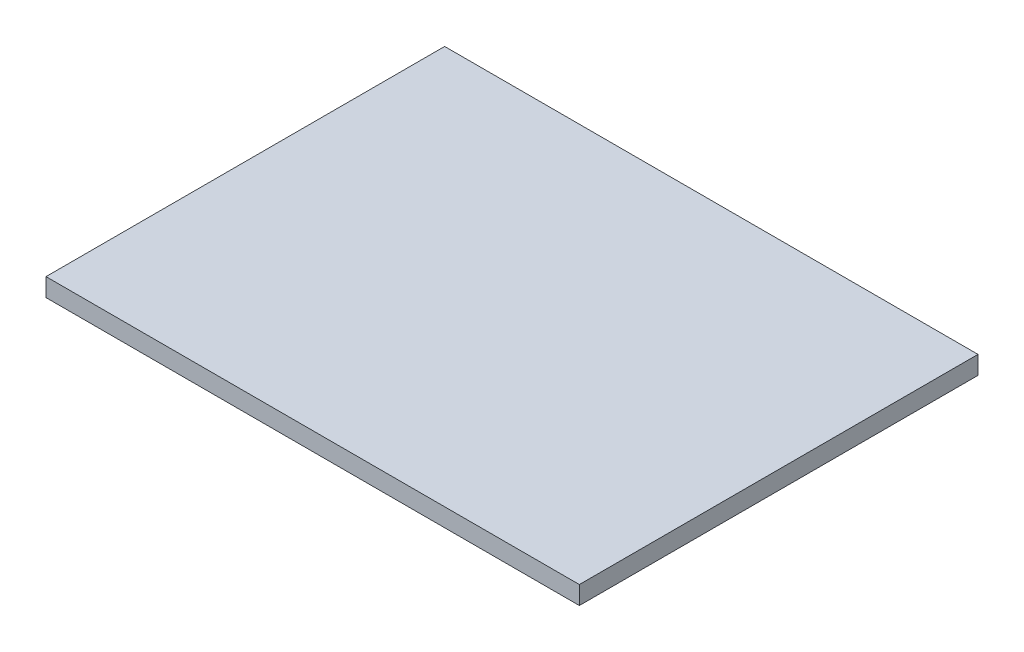
ISO-10303-21;
HEADER;
FILE_DESCRIPTION(('STEP AP214'),'2;1');
FILE_NAME('part.step','',(''),(''),'','','');
FILE_SCHEMA(('AUTOMOTIVE_DESIGN { 1 0 10303 214 1 1 1 1 }'));
ENDSEC;
DATA;
#1=APPLICATION_CONTEXT('core data for automotive mechanical design processes');
#2=APPLICATION_PROTOCOL_DEFINITION('international standard','automotive_design',2000,#1);
#3=PRODUCT_CONTEXT('',#1,'mechanical');
#4=PRODUCT('Part','Part','',(#3));
#5=PRODUCT_RELATED_PRODUCT_CATEGORY('part','',(#4));
#6=PRODUCT_DEFINITION_FORMATION('','',#4);
#7=PRODUCT_DEFINITION_CONTEXT('part definition',#1,'design');
#8=PRODUCT_DEFINITION('design','',#6,#7);
#9=PRODUCT_DEFINITION_SHAPE('','',#8);
#10=(LENGTH_UNIT() NAMED_UNIT(*) SI_UNIT(.MILLI.,.METRE.));
#11=(NAMED_UNIT(*) PLANE_ANGLE_UNIT() SI_UNIT($,.RADIAN.));
#12=(NAMED_UNIT(*) SI_UNIT($,.STERADIAN.) SOLID_ANGLE_UNIT());
#13=UNCERTAINTY_MEASURE_WITH_UNIT(LENGTH_MEASURE(1.E-05),#10,'distance_accuracy_value','');
#14=(GEOMETRIC_REPRESENTATION_CONTEXT(3) GLOBAL_UNCERTAINTY_ASSIGNED_CONTEXT((#13)) GLOBAL_UNIT_ASSIGNED_CONTEXT((#10,
#11,#12)) REPRESENTATION_CONTEXT('',''));
#15=CARTESIAN_POINT('',(0.,0.,0.));
#16=DIRECTION('',(0.,0.,1.));
#17=DIRECTION('',(1.,0.,0.));
#18=AXIS2_PLACEMENT_3D('',#15,#16,#17);
#19=CARTESIAN_POINT('',(146.5,10.,109.5));
#20=DIRECTION('',(-1.,0.,0.));
#21=DIRECTION('',(0.,0.,1.));
#22=AXIS2_PLACEMENT_3D('',#19,#20,#21);
#23=PLANE('',#22);
#24=DIRECTION('',(0.,0.,-1.));
#25=VECTOR('',#24,1.);
#26=CARTESIAN_POINT('',(146.5,0.,109.5));
#27=LINE('',#26,#25);
#28=CARTESIAN_POINT('',(146.5,0.,109.5));
#29=VERTEX_POINT('',#28);
#30=CARTESIAN_POINT('',(146.5,0.,-109.5));
#31=VERTEX_POINT('',#30);
#32=EDGE_CURVE('E107',#29,#31,#27,.T.);
#33=ORIENTED_EDGE('',*,*,#32,.T.);
#34=DIRECTION('',(0.,-1.,0.));
#35=VECTOR('',#34,1.);
#36=CARTESIAN_POINT('',(146.5,10.,-109.5));
#37=LINE('',#36,#35);
#38=CARTESIAN_POINT('',(146.5,10.,-109.5));
#39=VERTEX_POINT('',#38);
#40=EDGE_CURVE('E11',#39,#31,#37,.T.);
#41=ORIENTED_EDGE('',*,*,#40,.F.);
#42=DIRECTION('',(0.,0.,-1.));
#43=VECTOR('',#42,1.);
#44=CARTESIAN_POINT('',(146.5,10.,109.5));
#45=LINE('',#44,#43);
#46=CARTESIAN_POINT('',(146.5,10.,109.5));
#47=VERTEX_POINT('',#46);
#48=EDGE_CURVE('E91',#47,#39,#45,.T.);
#49=ORIENTED_EDGE('',*,*,#48,.F.);
#50=DIRECTION('',(0.,-1.,0.));
#51=VECTOR('',#50,1.);
#52=CARTESIAN_POINT('',(146.5,10.,109.5));
#53=LINE('',#52,#51);
#54=EDGE_CURVE('E103',#47,#29,#53,.T.);
#55=ORIENTED_EDGE('',*,*,#54,.T.);
#56=EDGE_LOOP('',(#33,#41,#49,#55));
#57=FACE_BOUND('',#56,.T.);
#58=ADVANCED_FACE('F39',(#57),#23,.F.);
#59=CARTESIAN_POINT('',(-146.5,10.,-109.5));
#60=DIRECTION('',(0.,0.,1.));
#61=DIRECTION('',(1.,0.,0.));
#62=AXIS2_PLACEMENT_3D('',#59,#60,#61);
#63=PLANE('',#62);
#64=DIRECTION('',(-1.,0.,0.));
#65=VECTOR('',#64,1.);
#66=CARTESIAN_POINT('',(-146.5,0.,-109.5));
#67=LINE('',#66,#65);
#68=CARTESIAN_POINT('',(-146.5,0.,-109.5));
#69=VERTEX_POINT('',#68);
#70=EDGE_CURVE('E96',#31,#69,#67,.T.);
#71=ORIENTED_EDGE('',*,*,#70,.T.);
#72=DIRECTION('',(0.,-1.,0.));
#73=VECTOR('',#72,1.);
#74=CARTESIAN_POINT('',(-146.5,10.,-109.5));
#75=LINE('',#74,#73);
#76=CARTESIAN_POINT('',(-146.5,10.,-109.5));
#77=VERTEX_POINT('',#76);
#78=EDGE_CURVE('E48',#77,#69,#75,.T.);
#79=ORIENTED_EDGE('',*,*,#78,.F.);
#80=DIRECTION('',(-1.,0.,0.));
#81=VECTOR('',#80,1.);
#82=CARTESIAN_POINT('',(-146.5,10.,-109.5));
#83=LINE('',#82,#81);
#84=EDGE_CURVE('E86',#39,#77,#83,.T.);
#85=ORIENTED_EDGE('',*,*,#84,.F.);
#86=ORIENTED_EDGE('',*,*,#40,.T.);
#87=EDGE_LOOP('',(#71,#79,#85,#86));
#88=FACE_BOUND('',#87,.T.);
#89=ADVANCED_FACE('F95',(#88),#63,.F.);
#90=CARTESIAN_POINT('',(-146.5,10.,109.5));
#91=DIRECTION('',(1.,0.,0.));
#92=DIRECTION('',(0.,0.,-1.));
#93=AXIS2_PLACEMENT_3D('',#90,#91,#92);
#94=PLANE('',#93);
#95=DIRECTION('',(0.,0.,1.));
#96=VECTOR('',#95,1.);
#97=CARTESIAN_POINT('',(-146.5,0.,109.5));
#98=LINE('',#97,#96);
#99=CARTESIAN_POINT('',(-146.5,0.,109.5));
#100=VERTEX_POINT('',#99);
#101=EDGE_CURVE('E73',#69,#100,#98,.T.);
#102=ORIENTED_EDGE('',*,*,#101,.T.);
#103=DIRECTION('',(0.,-1.,0.));
#104=VECTOR('',#103,1.);
#105=CARTESIAN_POINT('',(-146.5,10.,109.5));
#106=LINE('',#105,#104);
#107=CARTESIAN_POINT('',(-146.5,10.,109.5));
#108=VERTEX_POINT('',#107);
#109=EDGE_CURVE('E98',#108,#100,#106,.T.);
#110=ORIENTED_EDGE('',*,*,#109,.F.);
#111=DIRECTION('',(0.,0.,1.));
#112=VECTOR('',#111,1.);
#113=CARTESIAN_POINT('',(-146.5,10.,109.5));
#114=LINE('',#113,#112);
#115=EDGE_CURVE('E89',#77,#108,#114,.T.);
#116=ORIENTED_EDGE('',*,*,#115,.F.);
#117=ORIENTED_EDGE('',*,*,#78,.T.);
#118=EDGE_LOOP('',(#102,#110,#116,#117));
#119=FACE_BOUND('',#118,.T.);
#120=ADVANCED_FACE('F99',(#119),#94,.F.);
#121=CARTESIAN_POINT('',(-146.5,10.,109.5));
#122=DIRECTION('',(0.,0.,-1.));
#123=DIRECTION('',(-1.,0.,0.));
#124=AXIS2_PLACEMENT_3D('',#121,#122,#123);
#125=PLANE('',#124);
#126=DIRECTION('',(1.,0.,0.));
#127=VECTOR('',#126,1.);
#128=CARTESIAN_POINT('',(-146.5,0.,109.5));
#129=LINE('',#128,#127);
#130=EDGE_CURVE('E79',#100,#29,#129,.T.);
#131=ORIENTED_EDGE('',*,*,#130,.T.);
#132=ORIENTED_EDGE('',*,*,#54,.F.);
#133=DIRECTION('',(1.,0.,0.));
#134=VECTOR('',#133,1.);
#135=CARTESIAN_POINT('',(-146.5,10.,109.5));
#136=LINE('',#135,#134);
#137=EDGE_CURVE('E56',#108,#47,#136,.T.);
#138=ORIENTED_EDGE('',*,*,#137,.F.);
#139=ORIENTED_EDGE('',*,*,#109,.T.);
#140=EDGE_LOOP('',(#131,#132,#138,#139));
#141=FACE_BOUND('',#140,.T.);
#142=ADVANCED_FACE('F120',(#141),#125,.F.);
#143=CARTESIAN_POINT('',(0.,10.,0.));
#144=DIRECTION('',(0.,-1.,0.));
#145=DIRECTION('',(0.,0.,-1.));
#146=AXIS2_PLACEMENT_3D('',#143,#144,#145);
#147=PLANE('',#146);
#148=ORIENTED_EDGE('',*,*,#48,.T.);
#149=ORIENTED_EDGE('',*,*,#84,.T.);
#150=ORIENTED_EDGE('',*,*,#115,.T.);
#151=ORIENTED_EDGE('',*,*,#137,.T.);
#152=EDGE_LOOP('',(#148,#149,#150,#151));
#153=FACE_BOUND('',#152,.T.);
#154=ADVANCED_FACE('F87',(#153),#147,.F.);
#155=CARTESIAN_POINT('',(0.,0.,0.));
#156=DIRECTION('',(0.,-1.,0.));
#157=DIRECTION('',(0.,0.,-1.));
#158=AXIS2_PLACEMENT_3D('',#155,#156,#157);
#159=PLANE('',#158);
#160=ORIENTED_EDGE('',*,*,#32,.F.);
#161=ORIENTED_EDGE('',*,*,#130,.F.);
#162=ORIENTED_EDGE('',*,*,#101,.F.);
#163=ORIENTED_EDGE('',*,*,#70,.F.);
#164=EDGE_LOOP('',(#160,#161,#162,#163));
#165=FACE_BOUND('',#164,.T.);
#166=ADVANCED_FACE('F123',(#165),#159,.T.);
#167=CLOSED_SHELL('',(#58,#89,#120,#142,#154,#166));
#168=MANIFOLD_SOLID_BREP('B2',#167);
#169=ADVANCED_BREP_SHAPE_REPRESENTATION('',(#18,#168),#14);
#170=SHAPE_DEFINITION_REPRESENTATION(#9,#169);
ENDSEC;
END-ISO-10303-21;
